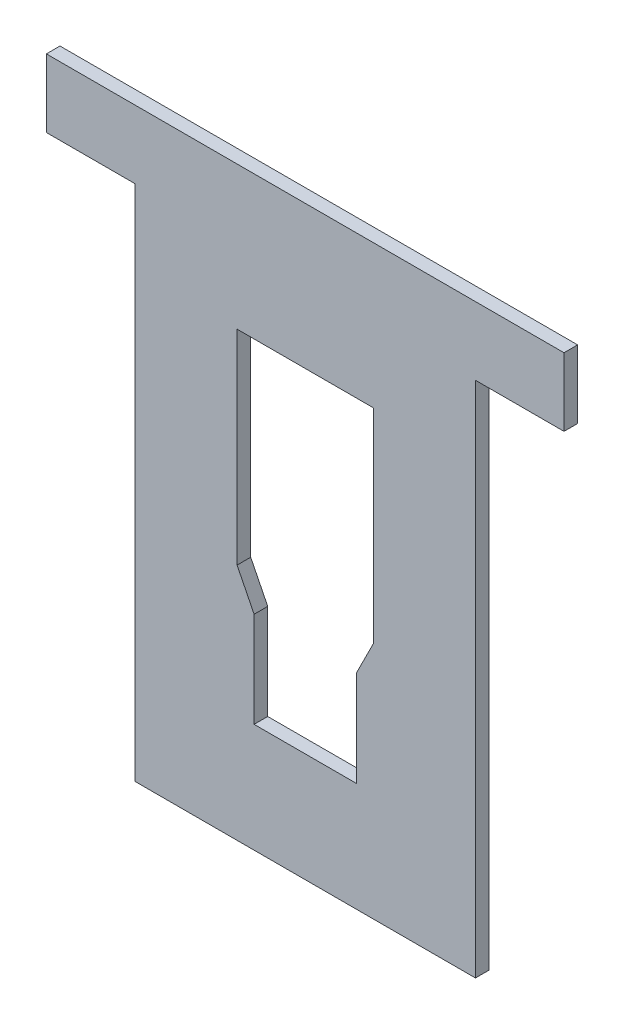
ISO-10303-21;
HEADER;
FILE_DESCRIPTION(('STEP AP214'),'2;1');
FILE_NAME('part.step','',(''),(''),'','','');
FILE_SCHEMA(('AUTOMOTIVE_DESIGN { 1 0 10303 214 1 1 1 1 }'));
ENDSEC;
DATA;
#1=APPLICATION_CONTEXT('core data for automotive mechanical design processes');
#2=APPLICATION_PROTOCOL_DEFINITION('international standard','automotive_design',2000,#1);
#3=PRODUCT_CONTEXT('',#1,'mechanical');
#4=PRODUCT('Part','Part','',(#3));
#5=PRODUCT_RELATED_PRODUCT_CATEGORY('part','',(#4));
#6=PRODUCT_DEFINITION_FORMATION('','',#4);
#7=PRODUCT_DEFINITION_CONTEXT('part definition',#1,'design');
#8=PRODUCT_DEFINITION('design','',#6,#7);
#9=PRODUCT_DEFINITION_SHAPE('','',#8);
#10=(LENGTH_UNIT() NAMED_UNIT(*) SI_UNIT(.MILLI.,.METRE.));
#11=(NAMED_UNIT(*) PLANE_ANGLE_UNIT() SI_UNIT($,.RADIAN.));
#12=(NAMED_UNIT(*) SI_UNIT($,.STERADIAN.) SOLID_ANGLE_UNIT());
#13=UNCERTAINTY_MEASURE_WITH_UNIT(LENGTH_MEASURE(1.E-05),#10,'distance_accuracy_value','');
#14=(GEOMETRIC_REPRESENTATION_CONTEXT(3) GLOBAL_UNCERTAINTY_ASSIGNED_CONTEXT((#13)) GLOBAL_UNIT_ASSIGNED_CONTEXT((#10,
#11,#12)) REPRESENTATION_CONTEXT('',''));
#15=CARTESIAN_POINT('',(0.,0.,0.));
#16=DIRECTION('',(0.,0.,1.));
#17=DIRECTION('',(1.,0.,0.));
#18=AXIS2_PLACEMENT_3D('',#15,#16,#17);
#19=CARTESIAN_POINT('',(0.,0.,0.508));
#20=DIRECTION('',(0.,0.,1.));
#21=DIRECTION('',(1.,0.,0.));
#22=AXIS2_PLACEMENT_3D('',#19,#20,#21);
#23=PLANE('',#22);
#24=DIRECTION('',(0.,-1.,0.));
#25=VECTOR('',#24,1.);
#26=CARTESIAN_POINT('',(0.,19.304,0.508));
#27=LINE('',#26,#25);
#28=CARTESIAN_POINT('',(0.,19.304,0.508));
#29=VERTEX_POINT('',#28);
#30=CARTESIAN_POINT('',(0.,0.,0.508));
#31=VERTEX_POINT('',#30);
#32=EDGE_CURVE('E247',#29,#31,#27,.T.);
#33=ORIENTED_EDGE('',*,*,#32,.T.);
#34=DIRECTION('',(1.,0.,0.));
#35=VECTOR('',#34,1.);
#36=CARTESIAN_POINT('',(0.,0.,0.508));
#37=LINE('',#36,#35);
#38=CARTESIAN_POINT('',(12.7,0.,0.508));
#39=VERTEX_POINT('',#38);
#40=EDGE_CURVE('E251',#31,#39,#37,.T.);
#41=ORIENTED_EDGE('',*,*,#40,.T.);
#42=DIRECTION('',(0.,1.,0.));
#43=VECTOR('',#42,1.);
#44=CARTESIAN_POINT('',(12.7,0.,0.508));
#45=LINE('',#44,#43);
#46=CARTESIAN_POINT('',(12.7,19.304,0.508));
#47=VERTEX_POINT('',#46);
#48=EDGE_CURVE('E255',#39,#47,#45,.T.);
#49=ORIENTED_EDGE('',*,*,#48,.T.);
#50=DIRECTION('',(1.,0.,0.));
#51=VECTOR('',#50,1.);
#52=CARTESIAN_POINT('',(12.7,19.304,0.508));
#53=LINE('',#52,#51);
#54=CARTESIAN_POINT('',(16.002,19.304,0.508));
#55=VERTEX_POINT('',#54);
#56=EDGE_CURVE('E258',#47,#55,#53,.T.);
#57=ORIENTED_EDGE('',*,*,#56,.T.);
#58=DIRECTION('',(0.,1.,0.));
#59=VECTOR('',#58,1.);
#60=CARTESIAN_POINT('',(16.002,19.304,0.508));
#61=LINE('',#60,#59);
#62=CARTESIAN_POINT('',(16.002,21.844,0.508));
#63=VERTEX_POINT('',#62);
#64=EDGE_CURVE('E261',#55,#63,#61,.T.);
#65=ORIENTED_EDGE('',*,*,#64,.T.);
#66=DIRECTION('',(-1.,0.,0.));
#67=VECTOR('',#66,1.);
#68=CARTESIAN_POINT('',(16.002,21.844,0.508));
#69=LINE('',#68,#67);
#70=CARTESIAN_POINT('',(-3.302,21.844,0.508));
#71=VERTEX_POINT('',#70);
#72=EDGE_CURVE('E264',#63,#71,#69,.T.);
#73=ORIENTED_EDGE('',*,*,#72,.T.);
#74=DIRECTION('',(0.,-1.,0.));
#75=VECTOR('',#74,1.);
#76=CARTESIAN_POINT('',(-3.302,21.844,0.508));
#77=LINE('',#76,#75);
#78=CARTESIAN_POINT('',(-3.302,19.304,0.508));
#79=VERTEX_POINT('',#78);
#80=EDGE_CURVE('E267',#71,#79,#77,.T.);
#81=ORIENTED_EDGE('',*,*,#80,.T.);
#82=DIRECTION('',(1.,0.,0.));
#83=VECTOR('',#82,1.);
#84=CARTESIAN_POINT('',(-3.302,19.304,0.508));
#85=LINE('',#84,#83);
#86=EDGE_CURVE('E270',#79,#29,#85,.T.);
#87=ORIENTED_EDGE('',*,*,#86,.T.);
#88=EDGE_LOOP('',(#33,#41,#49,#57,#65,#73,#81,#87));
#89=FACE_BOUND('',#88,.T.);
#90=DIRECTION('',(0.447213595499959,-0.894427190999915,0.));
#91=VECTOR('',#90,1.);
#92=CARTESIAN_POINT('',(4.445,7.62,0.508));
#93=LINE('',#92,#91);
#94=CARTESIAN_POINT('',(3.81,8.89,0.508));
#95=VERTEX_POINT('',#94);
#96=CARTESIAN_POINT('',(4.445,7.62,0.508));
#97=VERTEX_POINT('',#96);
#98=EDGE_CURVE('E166',#95,#97,#93,.T.);
#99=ORIENTED_EDGE('',*,*,#98,.F.);
#100=DIRECTION('',(0.,-1.,0.));
#101=VECTOR('',#100,1.);
#102=CARTESIAN_POINT('',(3.81,8.89,0.508));
#103=LINE('',#102,#101);
#104=CARTESIAN_POINT('',(3.81,16.51,0.508));
#105=VERTEX_POINT('',#104);
#106=EDGE_CURVE('E157',#105,#95,#103,.T.);
#107=ORIENTED_EDGE('',*,*,#106,.F.);
#108=DIRECTION('',(-1.,0.,0.));
#109=VECTOR('',#108,1.);
#110=CARTESIAN_POINT('',(3.81,16.51,0.508));
#111=LINE('',#110,#109);
#112=CARTESIAN_POINT('',(8.89,16.51,0.508));
#113=VERTEX_POINT('',#112);
#114=EDGE_CURVE('E199',#113,#105,#111,.T.);
#115=ORIENTED_EDGE('',*,*,#114,.F.);
#116=DIRECTION('',(0.,1.,0.));
#117=VECTOR('',#116,1.);
#118=CARTESIAN_POINT('',(8.89,16.51,0.508));
#119=LINE('',#118,#117);
#120=CARTESIAN_POINT('',(8.89,8.89,0.508));
#121=VERTEX_POINT('',#120);
#122=EDGE_CURVE('E196',#121,#113,#119,.T.);
#123=ORIENTED_EDGE('',*,*,#122,.F.);
#124=DIRECTION('',(0.447213595499959,0.894427190999915,0.));
#125=VECTOR('',#124,1.);
#126=CARTESIAN_POINT('',(8.89,8.89,0.508));
#127=LINE('',#126,#125);
#128=CARTESIAN_POINT('',(8.255,7.62,0.508));
#129=VERTEX_POINT('',#128);
#130=EDGE_CURVE('E193',#129,#121,#127,.T.);
#131=ORIENTED_EDGE('',*,*,#130,.F.);
#132=DIRECTION('',(0.,1.,0.));
#133=VECTOR('',#132,1.);
#134=CARTESIAN_POINT('',(8.255,7.62,0.508));
#135=LINE('',#134,#133);
#136=CARTESIAN_POINT('',(8.255,4.064,0.508));
#137=VERTEX_POINT('',#136);
#138=EDGE_CURVE('E190',#137,#129,#135,.T.);
#139=ORIENTED_EDGE('',*,*,#138,.F.);
#140=DIRECTION('',(1.,0.,0.));
#141=VECTOR('',#140,1.);
#142=CARTESIAN_POINT('',(8.255,4.064,0.508));
#143=LINE('',#142,#141);
#144=CARTESIAN_POINT('',(4.445,4.064,0.508));
#145=VERTEX_POINT('',#144);
#146=EDGE_CURVE('E185',#145,#137,#143,.T.);
#147=ORIENTED_EDGE('',*,*,#146,.F.);
#148=DIRECTION('',(0.,-1.,0.));
#149=VECTOR('',#148,1.);
#150=CARTESIAN_POINT('',(4.445,4.064,0.508));
#151=LINE('',#150,#149);
#152=EDGE_CURVE('E180',#97,#145,#151,.T.);
#153=ORIENTED_EDGE('',*,*,#152,.F.);
#154=EDGE_LOOP('',(#99,#107,#115,#123,#131,#139,#147,#153));
#155=FACE_BOUND('',#154,.T.);
#156=ADVANCED_FACE('F43',(#89,#155),#23,.T.);
#157=CARTESIAN_POINT('',(0.,0.,0.));
#158=DIRECTION('',(0.,0.,1.));
#159=DIRECTION('',(1.,0.,0.));
#160=AXIS2_PLACEMENT_3D('',#157,#158,#159);
#161=PLANE('',#160);
#162=DIRECTION('',(0.,-1.,0.));
#163=VECTOR('',#162,1.);
#164=CARTESIAN_POINT('',(0.,19.304,0.));
#165=LINE('',#164,#163);
#166=CARTESIAN_POINT('',(0.,19.304,0.));
#167=VERTEX_POINT('',#166);
#168=CARTESIAN_POINT('',(0.,0.,0.));
#169=VERTEX_POINT('',#168);
#170=EDGE_CURVE('E175',#167,#169,#165,.T.);
#171=ORIENTED_EDGE('',*,*,#170,.F.);
#172=DIRECTION('',(1.,0.,0.));
#173=VECTOR('',#172,1.);
#174=CARTESIAN_POINT('',(-3.302,19.304,0.));
#175=LINE('',#174,#173);
#176=CARTESIAN_POINT('',(-3.302,19.304,0.));
#177=VERTEX_POINT('',#176);
#178=EDGE_CURVE('E252',#177,#167,#175,.T.);
#179=ORIENTED_EDGE('',*,*,#178,.F.);
#180=DIRECTION('',(0.,-1.,0.));
#181=VECTOR('',#180,1.);
#182=CARTESIAN_POINT('',(-3.302,21.844,0.));
#183=LINE('',#182,#181);
#184=CARTESIAN_POINT('',(-3.302,21.844,0.));
#185=VERTEX_POINT('',#184);
#186=EDGE_CURVE('E292',#185,#177,#183,.T.);
#187=ORIENTED_EDGE('',*,*,#186,.F.);
#188=DIRECTION('',(-1.,0.,0.));
#189=VECTOR('',#188,1.);
#190=CARTESIAN_POINT('',(16.002,21.844,0.));
#191=LINE('',#190,#189);
#192=CARTESIAN_POINT('',(16.002,21.844,0.));
#193=VERTEX_POINT('',#192);
#194=EDGE_CURVE('E289',#193,#185,#191,.T.);
#195=ORIENTED_EDGE('',*,*,#194,.F.);
#196=DIRECTION('',(0.,1.,0.));
#197=VECTOR('',#196,1.);
#198=CARTESIAN_POINT('',(16.002,19.304,0.));
#199=LINE('',#198,#197);
#200=CARTESIAN_POINT('',(16.002,19.304,0.));
#201=VERTEX_POINT('',#200);
#202=EDGE_CURVE('E286',#201,#193,#199,.T.);
#203=ORIENTED_EDGE('',*,*,#202,.F.);
#204=DIRECTION('',(1.,0.,0.));
#205=VECTOR('',#204,1.);
#206=CARTESIAN_POINT('',(12.7,19.304,0.));
#207=LINE('',#206,#205);
#208=CARTESIAN_POINT('',(12.7,19.304,0.));
#209=VERTEX_POINT('',#208);
#210=EDGE_CURVE('E283',#209,#201,#207,.T.);
#211=ORIENTED_EDGE('',*,*,#210,.F.);
#212=DIRECTION('',(0.,1.,0.));
#213=VECTOR('',#212,1.);
#214=CARTESIAN_POINT('',(12.7,0.,0.));
#215=LINE('',#214,#213);
#216=CARTESIAN_POINT('',(12.7,0.,0.));
#217=VERTEX_POINT('',#216);
#218=EDGE_CURVE('E280',#217,#209,#215,.T.);
#219=ORIENTED_EDGE('',*,*,#218,.F.);
#220=DIRECTION('',(1.,0.,0.));
#221=VECTOR('',#220,1.);
#222=CARTESIAN_POINT('',(0.,0.,0.));
#223=LINE('',#222,#221);
#224=EDGE_CURVE('E277',#169,#217,#223,.T.);
#225=ORIENTED_EDGE('',*,*,#224,.F.);
#226=EDGE_LOOP('',(#171,#179,#187,#195,#203,#211,#219,#225));
#227=FACE_BOUND('',#226,.T.);
#228=DIRECTION('',(0.,-1.,0.));
#229=VECTOR('',#228,1.);
#230=CARTESIAN_POINT('',(3.81,8.89,0.));
#231=LINE('',#230,#229);
#232=CARTESIAN_POINT('',(3.81,16.51,0.));
#233=VERTEX_POINT('',#232);
#234=CARTESIAN_POINT('',(3.81,8.89,0.));
#235=VERTEX_POINT('',#234);
#236=EDGE_CURVE('E67',#233,#235,#231,.T.);
#237=ORIENTED_EDGE('',*,*,#236,.T.);
#238=DIRECTION('',(0.447213595499959,-0.894427190999915,0.));
#239=VECTOR('',#238,1.);
#240=CARTESIAN_POINT('',(4.445,7.62,0.));
#241=LINE('',#240,#239);
#242=CARTESIAN_POINT('',(4.445,7.62,0.));
#243=VERTEX_POINT('',#242);
#244=EDGE_CURVE('E173',#235,#243,#241,.T.);
#245=ORIENTED_EDGE('',*,*,#244,.T.);
#246=DIRECTION('',(0.,-1.,0.));
#247=VECTOR('',#246,1.);
#248=CARTESIAN_POINT('',(4.445,4.064,0.));
#249=LINE('',#248,#247);
#250=CARTESIAN_POINT('',(4.445,4.064,0.));
#251=VERTEX_POINT('',#250);
#252=EDGE_CURVE('E206',#243,#251,#249,.T.);
#253=ORIENTED_EDGE('',*,*,#252,.T.);
#254=DIRECTION('',(1.,0.,0.));
#255=VECTOR('',#254,1.);
#256=CARTESIAN_POINT('',(8.255,4.064,0.));
#257=LINE('',#256,#255);
#258=CARTESIAN_POINT('',(8.255,4.064,0.));
#259=VERTEX_POINT('',#258);
#260=EDGE_CURVE('E210',#251,#259,#257,.T.);
#261=ORIENTED_EDGE('',*,*,#260,.T.);
#262=DIRECTION('',(0.,1.,0.));
#263=VECTOR('',#262,1.);
#264=CARTESIAN_POINT('',(8.255,7.62,0.));
#265=LINE('',#264,#263);
#266=CARTESIAN_POINT('',(8.255,7.62,0.));
#267=VERTEX_POINT('',#266);
#268=EDGE_CURVE('E214',#259,#267,#265,.T.);
#269=ORIENTED_EDGE('',*,*,#268,.T.);
#270=DIRECTION('',(0.447213595499959,0.894427190999915,0.));
#271=VECTOR('',#270,1.);
#272=CARTESIAN_POINT('',(8.89,8.89,0.));
#273=LINE('',#272,#271);
#274=CARTESIAN_POINT('',(8.89,8.89,0.));
#275=VERTEX_POINT('',#274);
#276=EDGE_CURVE('E218',#267,#275,#273,.T.);
#277=ORIENTED_EDGE('',*,*,#276,.T.);
#278=DIRECTION('',(0.,1.,0.));
#279=VECTOR('',#278,1.);
#280=CARTESIAN_POINT('',(8.89,16.51,0.));
#281=LINE('',#280,#279);
#282=CARTESIAN_POINT('',(8.89,16.51,0.));
#283=VERTEX_POINT('',#282);
#284=EDGE_CURVE('E222',#275,#283,#281,.T.);
#285=ORIENTED_EDGE('',*,*,#284,.T.);
#286=DIRECTION('',(-1.,0.,0.));
#287=VECTOR('',#286,1.);
#288=CARTESIAN_POINT('',(3.81,16.51,0.));
#289=LINE('',#288,#287);
#290=EDGE_CURVE('E167',#283,#233,#289,.T.);
#291=ORIENTED_EDGE('',*,*,#290,.T.);
#292=EDGE_LOOP('',(#237,#245,#253,#261,#269,#277,#285,#291));
#293=FACE_BOUND('',#292,.T.);
#294=ADVANCED_FACE('F332',(#227,#293),#161,.F.);
#295=CARTESIAN_POINT('',(0.,19.304,0.508));
#296=DIRECTION('',(1.,0.,0.));
#297=DIRECTION('',(0.,0.,-1.));
#298=AXIS2_PLACEMENT_3D('',#295,#296,#297);
#299=PLANE('',#298);
#300=ORIENTED_EDGE('',*,*,#170,.T.);
#301=DIRECTION('',(0.,0.,-1.));
#302=VECTOR('',#301,1.);
#303=CARTESIAN_POINT('',(0.,0.,0.508));
#304=LINE('',#303,#302);
#305=EDGE_CURVE('E11',#31,#169,#304,.T.);
#306=ORIENTED_EDGE('',*,*,#305,.F.);
#307=ORIENTED_EDGE('',*,*,#32,.F.);
#308=DIRECTION('',(0.,0.,-1.));
#309=VECTOR('',#308,1.);
#310=CARTESIAN_POINT('',(0.,19.304,0.508));
#311=LINE('',#310,#309);
#312=EDGE_CURVE('E273',#29,#167,#311,.T.);
#313=ORIENTED_EDGE('',*,*,#312,.T.);
#314=EDGE_LOOP('',(#300,#306,#307,#313));
#315=FACE_BOUND('',#314,.T.);
#316=ADVANCED_FACE('F45',(#315),#299,.F.);
#317=CARTESIAN_POINT('',(0.,0.,0.508));
#318=DIRECTION('',(0.,1.,0.));
#319=DIRECTION('',(0.,0.,1.));
#320=AXIS2_PLACEMENT_3D('',#317,#318,#319);
#321=PLANE('',#320);
#322=ORIENTED_EDGE('',*,*,#224,.T.);
#323=DIRECTION('',(0.,0.,-1.));
#324=VECTOR('',#323,1.);
#325=CARTESIAN_POINT('',(12.7,0.,0.508));
#326=LINE('',#325,#324);
#327=EDGE_CURVE('E52',#39,#217,#326,.T.);
#328=ORIENTED_EDGE('',*,*,#327,.F.);
#329=ORIENTED_EDGE('',*,*,#40,.F.);
#330=ORIENTED_EDGE('',*,*,#305,.T.);
#331=EDGE_LOOP('',(#322,#328,#329,#330));
#332=FACE_BOUND('',#331,.T.);
#333=ADVANCED_FACE('F349',(#332),#321,.F.);
#334=CARTESIAN_POINT('',(12.7,0.,0.508));
#335=DIRECTION('',(-1.,0.,0.));
#336=DIRECTION('',(0.,0.,1.));
#337=AXIS2_PLACEMENT_3D('',#334,#335,#336);
#338=PLANE('',#337);
#339=ORIENTED_EDGE('',*,*,#218,.T.);
#340=DIRECTION('',(0.,0.,-1.));
#341=VECTOR('',#340,1.);
#342=CARTESIAN_POINT('',(12.7,19.304,0.508));
#343=LINE('',#342,#341);
#344=EDGE_CURVE('E316',#47,#209,#343,.T.);
#345=ORIENTED_EDGE('',*,*,#344,.F.);
#346=ORIENTED_EDGE('',*,*,#48,.F.);
#347=ORIENTED_EDGE('',*,*,#327,.T.);
#348=EDGE_LOOP('',(#339,#345,#346,#347));
#349=FACE_BOUND('',#348,.T.);
#350=ADVANCED_FACE('F326',(#349),#338,.F.);
#351=CARTESIAN_POINT('',(12.7,19.304,0.508));
#352=DIRECTION('',(0.,1.,0.));
#353=DIRECTION('',(-1.,0.,0.));
#354=AXIS2_PLACEMENT_3D('',#351,#352,#353);
#355=PLANE('',#354);
#356=ORIENTED_EDGE('',*,*,#210,.T.);
#357=DIRECTION('',(0.,0.,-1.));
#358=VECTOR('',#357,1.);
#359=CARTESIAN_POINT('',(16.002,19.304,0.508));
#360=LINE('',#359,#358);
#361=EDGE_CURVE('E312',#55,#201,#360,.T.);
#362=ORIENTED_EDGE('',*,*,#361,.F.);
#363=ORIENTED_EDGE('',*,*,#56,.F.);
#364=ORIENTED_EDGE('',*,*,#344,.T.);
#365=EDGE_LOOP('',(#356,#362,#363,#364));
#366=FACE_BOUND('',#365,.T.);
#367=ADVANCED_FACE('F338',(#366),#355,.F.);
#368=CARTESIAN_POINT('',(16.002,19.304,0.508));
#369=DIRECTION('',(-1.,0.,0.));
#370=DIRECTION('',(0.,0.,1.));
#371=AXIS2_PLACEMENT_3D('',#368,#369,#370);
#372=PLANE('',#371);
#373=ORIENTED_EDGE('',*,*,#202,.T.);
#374=DIRECTION('',(0.,0.,-1.));
#375=VECTOR('',#374,1.);
#376=CARTESIAN_POINT('',(16.002,21.844,0.508));
#377=LINE('',#376,#375);
#378=EDGE_CURVE('E308',#63,#193,#377,.T.);
#379=ORIENTED_EDGE('',*,*,#378,.F.);
#380=ORIENTED_EDGE('',*,*,#64,.F.);
#381=ORIENTED_EDGE('',*,*,#361,.T.);
#382=EDGE_LOOP('',(#373,#379,#380,#381));
#383=FACE_BOUND('',#382,.T.);
#384=ADVANCED_FACE('F342',(#383),#372,.F.);
#385=CARTESIAN_POINT('',(16.002,21.844,0.508));
#386=DIRECTION('',(0.,-1.,0.));
#387=DIRECTION('',(0.,0.,-1.));
#388=AXIS2_PLACEMENT_3D('',#385,#386,#387);
#389=PLANE('',#388);
#390=ORIENTED_EDGE('',*,*,#194,.T.);
#391=DIRECTION('',(0.,0.,-1.));
#392=VECTOR('',#391,1.);
#393=CARTESIAN_POINT('',(-3.302,21.844,0.508));
#394=LINE('',#393,#392);
#395=EDGE_CURVE('E304',#71,#185,#394,.T.);
#396=ORIENTED_EDGE('',*,*,#395,.F.);
#397=ORIENTED_EDGE('',*,*,#72,.F.);
#398=ORIENTED_EDGE('',*,*,#378,.T.);
#399=EDGE_LOOP('',(#390,#396,#397,#398));
#400=FACE_BOUND('',#399,.T.);
#401=ADVANCED_FACE('F362',(#400),#389,.F.);
#402=CARTESIAN_POINT('',(-3.302,21.844,0.508));
#403=DIRECTION('',(1.,0.,0.));
#404=DIRECTION('',(0.,0.,-1.));
#405=AXIS2_PLACEMENT_3D('',#402,#403,#404);
#406=PLANE('',#405);
#407=ORIENTED_EDGE('',*,*,#186,.T.);
#408=DIRECTION('',(0.,0.,-1.));
#409=VECTOR('',#408,1.);
#410=CARTESIAN_POINT('',(-3.302,19.304,0.508));
#411=LINE('',#410,#409);
#412=EDGE_CURVE('E300',#79,#177,#411,.T.);
#413=ORIENTED_EDGE('',*,*,#412,.F.);
#414=ORIENTED_EDGE('',*,*,#80,.F.);
#415=ORIENTED_EDGE('',*,*,#395,.T.);
#416=EDGE_LOOP('',(#407,#413,#414,#415));
#417=FACE_BOUND('',#416,.T.);
#418=ADVANCED_FACE('F360',(#417),#406,.F.);
#419=CARTESIAN_POINT('',(-3.302,19.304,0.508));
#420=DIRECTION('',(0.,1.,0.));
#421=DIRECTION('',(-1.,0.,0.));
#422=AXIS2_PLACEMENT_3D('',#419,#420,#421);
#423=PLANE('',#422);
#424=ORIENTED_EDGE('',*,*,#178,.T.);
#425=ORIENTED_EDGE('',*,*,#312,.F.);
#426=ORIENTED_EDGE('',*,*,#86,.F.);
#427=ORIENTED_EDGE('',*,*,#412,.T.);
#428=EDGE_LOOP('',(#424,#425,#426,#427));
#429=FACE_BOUND('',#428,.T.);
#430=ADVANCED_FACE('F355',(#429),#423,.F.);
#431=CARTESIAN_POINT('',(3.81,8.89,0.508));
#432=DIRECTION('',(1.,0.,0.));
#433=DIRECTION('',(0.,1.,0.));
#434=AXIS2_PLACEMENT_3D('',#431,#432,#433);
#435=PLANE('',#434);
#436=ORIENTED_EDGE('',*,*,#236,.F.);
#437=DIRECTION('',(0.,0.,-1.));
#438=VECTOR('',#437,1.);
#439=CARTESIAN_POINT('',(3.81,16.51,0.508));
#440=LINE('',#439,#438);
#441=EDGE_CURVE('E161',#105,#233,#440,.T.);
#442=ORIENTED_EDGE('',*,*,#441,.F.);
#443=ORIENTED_EDGE('',*,*,#106,.T.);
#444=DIRECTION('',(0.,0.,-1.));
#445=VECTOR('',#444,1.);
#446=CARTESIAN_POINT('',(3.81,8.89,0.508));
#447=LINE('',#446,#445);
#448=EDGE_CURVE('E160',#95,#235,#447,.T.);
#449=ORIENTED_EDGE('',*,*,#448,.T.);
#450=EDGE_LOOP('',(#436,#442,#443,#449));
#451=FACE_BOUND('',#450,.T.);
#452=ADVANCED_FACE('F159',(#451),#435,.T.);
#453=CARTESIAN_POINT('',(4.445,7.62,0.508));
#454=DIRECTION('',(0.894427190999915,0.447213595499959,0.));
#455=DIRECTION('',(-0.447213595499959,0.894427190999915,0.));
#456=AXIS2_PLACEMENT_3D('',#453,#454,#455);
#457=PLANE('',#456);
#458=ORIENTED_EDGE('',*,*,#244,.F.);
#459=ORIENTED_EDGE('',*,*,#448,.F.);
#460=ORIENTED_EDGE('',*,*,#98,.T.);
#461=DIRECTION('',(0.,0.,-1.));
#462=VECTOR('',#461,1.);
#463=CARTESIAN_POINT('',(4.445,7.62,0.508));
#464=LINE('',#463,#462);
#465=EDGE_CURVE('E176',#97,#243,#464,.T.);
#466=ORIENTED_EDGE('',*,*,#465,.T.);
#467=EDGE_LOOP('',(#458,#459,#460,#466));
#468=FACE_BOUND('',#467,.T.);
#469=ADVANCED_FACE('F170',(#468),#457,.T.);
#470=CARTESIAN_POINT('',(4.445,4.064,0.508));
#471=DIRECTION('',(1.,0.,0.));
#472=DIRECTION('',(0.,0.,-1.));
#473=AXIS2_PLACEMENT_3D('',#470,#471,#472);
#474=PLANE('',#473);
#475=ORIENTED_EDGE('',*,*,#252,.F.);
#476=ORIENTED_EDGE('',*,*,#465,.F.);
#477=ORIENTED_EDGE('',*,*,#152,.T.);
#478=DIRECTION('',(0.,0.,-1.));
#479=VECTOR('',#478,1.);
#480=CARTESIAN_POINT('',(4.445,4.064,0.508));
#481=LINE('',#480,#479);
#482=EDGE_CURVE('E242',#145,#251,#481,.T.);
#483=ORIENTED_EDGE('',*,*,#482,.T.);
#484=EDGE_LOOP('',(#475,#476,#477,#483));
#485=FACE_BOUND('',#484,.T.);
#486=ADVANCED_FACE('F387',(#485),#474,.T.);
#487=CARTESIAN_POINT('',(8.255,4.064,0.508));
#488=DIRECTION('',(0.,1.,0.));
#489=DIRECTION('',(0.,0.,1.));
#490=AXIS2_PLACEMENT_3D('',#487,#488,#489);
#491=PLANE('',#490);
#492=ORIENTED_EDGE('',*,*,#260,.F.);
#493=ORIENTED_EDGE('',*,*,#482,.F.);
#494=ORIENTED_EDGE('',*,*,#146,.T.);
#495=DIRECTION('',(0.,0.,-1.));
#496=VECTOR('',#495,1.);
#497=CARTESIAN_POINT('',(8.255,4.064,0.508));
#498=LINE('',#497,#496);
#499=EDGE_CURVE('E239',#137,#259,#498,.T.);
#500=ORIENTED_EDGE('',*,*,#499,.T.);
#501=EDGE_LOOP('',(#492,#493,#494,#500));
#502=FACE_BOUND('',#501,.T.);
#503=ADVANCED_FACE('F391',(#502),#491,.T.);
#504=CARTESIAN_POINT('',(8.255,7.62,0.508));
#505=DIRECTION('',(-1.,0.,0.));
#506=DIRECTION('',(0.,0.,1.));
#507=AXIS2_PLACEMENT_3D('',#504,#505,#506);
#508=PLANE('',#507);
#509=ORIENTED_EDGE('',*,*,#268,.F.);
#510=ORIENTED_EDGE('',*,*,#499,.F.);
#511=ORIENTED_EDGE('',*,*,#138,.T.);
#512=DIRECTION('',(0.,0.,-1.));
#513=VECTOR('',#512,1.);
#514=CARTESIAN_POINT('',(8.255,7.62,0.508));
#515=LINE('',#514,#513);
#516=EDGE_CURVE('E236',#129,#267,#515,.T.);
#517=ORIENTED_EDGE('',*,*,#516,.T.);
#518=EDGE_LOOP('',(#509,#510,#511,#517));
#519=FACE_BOUND('',#518,.T.);
#520=ADVANCED_FACE('F397',(#519),#508,.T.);
#521=CARTESIAN_POINT('',(8.89,8.89,0.508));
#522=DIRECTION('',(-0.894427190999915,0.447213595499959,0.));
#523=DIRECTION('',(-0.447213595499959,-0.894427190999915,0.));
#524=AXIS2_PLACEMENT_3D('',#521,#522,#523);
#525=PLANE('',#524);
#526=ORIENTED_EDGE('',*,*,#276,.F.);
#527=ORIENTED_EDGE('',*,*,#516,.F.);
#528=ORIENTED_EDGE('',*,*,#130,.T.);
#529=DIRECTION('',(0.,0.,-1.));
#530=VECTOR('',#529,1.);
#531=CARTESIAN_POINT('',(8.89,8.89,0.508));
#532=LINE('',#531,#530);
#533=EDGE_CURVE('E233',#121,#275,#532,.T.);
#534=ORIENTED_EDGE('',*,*,#533,.T.);
#535=EDGE_LOOP('',(#526,#527,#528,#534));
#536=FACE_BOUND('',#535,.T.);
#537=ADVANCED_FACE('F401',(#536),#525,.T.);
#538=CARTESIAN_POINT('',(8.89,16.51,0.508));
#539=DIRECTION('',(-1.,0.,0.));
#540=DIRECTION('',(0.,0.,1.));
#541=AXIS2_PLACEMENT_3D('',#538,#539,#540);
#542=PLANE('',#541);
#543=ORIENTED_EDGE('',*,*,#284,.F.);
#544=ORIENTED_EDGE('',*,*,#533,.F.);
#545=ORIENTED_EDGE('',*,*,#122,.T.);
#546=DIRECTION('',(0.,0.,-1.));
#547=VECTOR('',#546,1.);
#548=CARTESIAN_POINT('',(8.89,16.51,0.508));
#549=LINE('',#548,#547);
#550=EDGE_CURVE('E59',#113,#283,#549,.T.);
#551=ORIENTED_EDGE('',*,*,#550,.T.);
#552=EDGE_LOOP('',(#543,#544,#545,#551));
#553=FACE_BOUND('',#552,.T.);
#554=ADVANCED_FACE('F405',(#553),#542,.T.);
#555=CARTESIAN_POINT('',(3.81,16.51,0.508));
#556=DIRECTION('',(0.,-1.,0.));
#557=DIRECTION('',(0.,0.,-1.));
#558=AXIS2_PLACEMENT_3D('',#555,#556,#557);
#559=PLANE('',#558);
#560=ORIENTED_EDGE('',*,*,#290,.F.);
#561=ORIENTED_EDGE('',*,*,#550,.F.);
#562=ORIENTED_EDGE('',*,*,#114,.T.);
#563=ORIENTED_EDGE('',*,*,#441,.T.);
#564=EDGE_LOOP('',(#560,#561,#562,#563));
#565=FACE_BOUND('',#564,.T.);
#566=ADVANCED_FACE('F409',(#565),#559,.T.);
#567=CLOSED_SHELL('',(#156,#294,#316,#333,#350,#367,#384,#401,#418,#430,#452,#469,#486,#503,
#520,#537,#554,#566));
#568=MANIFOLD_SOLID_BREP('B2',#567);
#569=ADVANCED_BREP_SHAPE_REPRESENTATION('',(#18,#568),#14);
#570=SHAPE_DEFINITION_REPRESENTATION(#9,#569);
ENDSEC;
END-ISO-10303-21;
